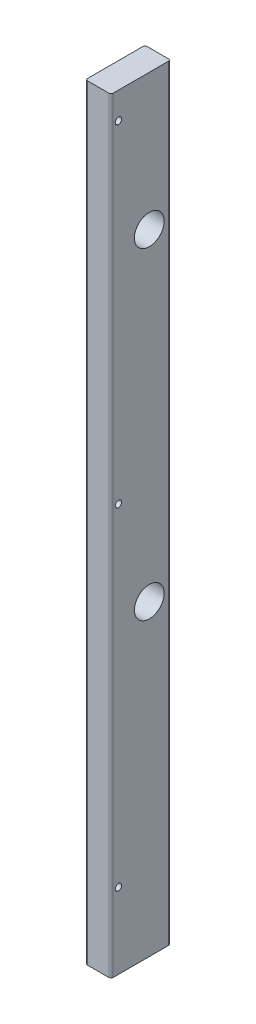
ISO-10303-21;
HEADER;
FILE_DESCRIPTION(('STEP AP214'),'2;1');
FILE_NAME('part.step','',(''),(''),'','','');
FILE_SCHEMA(('AUTOMOTIVE_DESIGN { 1 0 10303 214 1 1 1 1 }'));
ENDSEC;
DATA;
#1=APPLICATION_CONTEXT('core data for automotive mechanical design processes');
#2=APPLICATION_PROTOCOL_DEFINITION('international standard','automotive_design',2000,#1);
#3=PRODUCT_CONTEXT('',#1,'mechanical');
#4=PRODUCT('Part','Part','',(#3));
#5=PRODUCT_RELATED_PRODUCT_CATEGORY('part','',(#4));
#6=PRODUCT_DEFINITION_FORMATION('','',#4);
#7=PRODUCT_DEFINITION_CONTEXT('part definition',#1,'design');
#8=PRODUCT_DEFINITION('design','',#6,#7);
#9=PRODUCT_DEFINITION_SHAPE('','',#8);
#10=(LENGTH_UNIT() NAMED_UNIT(*) SI_UNIT(.MILLI.,.METRE.));
#11=(NAMED_UNIT(*) PLANE_ANGLE_UNIT() SI_UNIT($,.RADIAN.));
#12=(NAMED_UNIT(*) SI_UNIT($,.STERADIAN.) SOLID_ANGLE_UNIT());
#13=UNCERTAINTY_MEASURE_WITH_UNIT(LENGTH_MEASURE(1.E-05),#10,'distance_accuracy_value','');
#14=(GEOMETRIC_REPRESENTATION_CONTEXT(3) GLOBAL_UNCERTAINTY_ASSIGNED_CONTEXT((#13)) GLOBAL_UNIT_ASSIGNED_CONTEXT((#10,
#11,#12)) REPRESENTATION_CONTEXT('',''));
#15=CARTESIAN_POINT('',(0.,0.,0.));
#16=DIRECTION('',(0.,0.,1.));
#17=DIRECTION('',(1.,0.,0.));
#18=AXIS2_PLACEMENT_3D('',#15,#16,#17);
#19=CARTESIAN_POINT('',(19.0500000000009,1143.,44.45));
#20=DIRECTION('',(-1.,0.,0.));
#21=DIRECTION('',(0.,0.,1.));
#22=AXIS2_PLACEMENT_3D('',#19,#20,#21);
#23=PLANE('',#22);
#24=CARTESIAN_POINT('',(19.0500000000009,112.7125,33.3375));
#25=DIRECTION('',(1.,0.,0.));
#26=DIRECTION('',(0.,0.,-1.));
#27=AXIS2_PLACEMENT_3D('',#24,#25,#26);
#28=CIRCLE('',#27,4.7625);
#29=CARTESIAN_POINT('',(19.0500000000009,112.7125,28.575));
#30=VERTEX_POINT('',#29);
#31=EDGE_CURVE('E193',#30,#30,#28,.T.);
#32=ORIENTED_EDGE('',*,*,#31,.F.);
#33=EDGE_LOOP('',(#32));
#34=FACE_BOUND('',#33,.T.);
#35=CARTESIAN_POINT('',(19.0500000000009,608.0125,33.3375));
#36=DIRECTION('',(1.,0.,0.));
#37=DIRECTION('',(0.,0.,-1.));
#38=AXIS2_PLACEMENT_3D('',#35,#36,#37);
#39=CIRCLE('',#38,4.76250000000007);
#40=CARTESIAN_POINT('',(19.0500000000009,608.0125,28.5749999999999));
#41=VERTEX_POINT('',#40);
#42=EDGE_CURVE('E187',#41,#41,#39,.T.);
#43=ORIENTED_EDGE('',*,*,#42,.F.);
#44=EDGE_LOOP('',(#43));
#45=FACE_BOUND('',#44,.T.);
#46=CARTESIAN_POINT('',(19.0500000000009,1103.3125,33.3375000000001));
#47=DIRECTION('',(1.,0.,0.));
#48=DIRECTION('',(0.,0.,-1.));
#49=AXIS2_PLACEMENT_3D('',#46,#47,#48);
#50=CIRCLE('',#49,4.76250000000004);
#51=CARTESIAN_POINT('',(19.0500000000009,1103.3125,28.5750000000001));
#52=VERTEX_POINT('',#51);
#53=EDGE_CURVE('E181',#52,#52,#50,.T.);
#54=ORIENTED_EDGE('',*,*,#53,.F.);
#55=EDGE_LOOP('',(#54));
#56=FACE_BOUND('',#55,.T.);
#57=CARTESIAN_POINT('',(19.0499999999991,458.7875,-12.6999999999999));
#58=DIRECTION('',(1.,0.,0.));
#59=DIRECTION('',(0.,0.,-1.));
#60=AXIS2_PLACEMENT_3D('',#57,#58,#59);
#61=CIRCLE('',#60,22.225);
#62=CARTESIAN_POINT('',(19.0499999999991,458.7875,-34.9249999999999));
#63=VERTEX_POINT('',#62);
#64=EDGE_CURVE('E136',#63,#63,#61,.T.);
#65=ORIENTED_EDGE('',*,*,#64,.F.);
#66=EDGE_LOOP('',(#65));
#67=FACE_BOUND('',#66,.T.);
#68=CARTESIAN_POINT('',(19.0499999999991,939.8,-12.6999999999999));
#69=DIRECTION('',(1.,0.,0.));
#70=DIRECTION('',(0.,0.,-1.));
#71=AXIS2_PLACEMENT_3D('',#68,#69,#70);
#72=CIRCLE('',#71,22.225);
#73=CARTESIAN_POINT('',(19.0499999999991,939.8,-34.9249999999999));
#74=VERTEX_POINT('',#73);
#75=EDGE_CURVE('E175',#74,#74,#72,.T.);
#76=ORIENTED_EDGE('',*,*,#75,.F.);
#77=EDGE_LOOP('',(#76));
#78=FACE_BOUND('',#77,.T.);
#79=DIRECTION('',(0.,0.,-1.));
#80=VECTOR('',#79,1.);
#81=CARTESIAN_POINT('',(19.0500000000009,0.,44.45));
#82=LINE('',#81,#80);
#83=CARTESIAN_POINT('',(19.0500000000009,0.,41.275));
#84=VERTEX_POINT('',#83);
#85=CARTESIAN_POINT('',(19.05,0.,-41.275));
#86=VERTEX_POINT('',#85);
#87=EDGE_CURVE('E128',#84,#86,#82,.T.);
#88=ORIENTED_EDGE('',*,*,#87,.T.);
#89=DIRECTION('',(0.,-1.,0.));
#90=VECTOR('',#89,1.);
#91=CARTESIAN_POINT('',(19.05,1143.,-41.275));
#92=LINE('',#91,#90);
#93=CARTESIAN_POINT('',(19.05,1143.,-41.275));
#94=VERTEX_POINT('',#93);
#95=EDGE_CURVE('E11',#86,#94,#92,.F.);
#96=ORIENTED_EDGE('',*,*,#95,.T.);
#97=DIRECTION('',(0.,0.,-1.));
#98=VECTOR('',#97,1.);
#99=CARTESIAN_POINT('',(19.0500000000009,1143.,44.45));
#100=LINE('',#99,#98);
#101=CARTESIAN_POINT('',(19.0500000000009,1143.,41.275));
#102=VERTEX_POINT('',#101);
#103=EDGE_CURVE('E126',#102,#94,#100,.T.);
#104=ORIENTED_EDGE('',*,*,#103,.F.);
#105=DIRECTION('',(0.,-1.,0.));
#106=VECTOR('',#105,1.);
#107=CARTESIAN_POINT('',(19.0500000000009,1143.,41.275));
#108=LINE('',#107,#106);
#109=EDGE_CURVE('E40',#102,#84,#108,.T.);
#110=ORIENTED_EDGE('',*,*,#109,.T.);
#111=EDGE_LOOP('',(#88,#96,#104,#110));
#112=FACE_BOUND('',#111,.T.);
#113=ADVANCED_FACE('F32',(#34,#45,#56,#67,#78,#112),#23,.F.);
#114=CARTESIAN_POINT('',(-19.05,1143.,-44.4499999999999));
#115=DIRECTION('',(0.,0.,1.));
#116=DIRECTION('',(1.,0.,0.));
#117=AXIS2_PLACEMENT_3D('',#114,#115,#116);
#118=PLANE('',#117);
#119=DIRECTION('',(-1.,0.,0.));
#120=VECTOR('',#119,1.);
#121=CARTESIAN_POINT('',(-19.05,0.,-44.45));
#122=LINE('',#121,#120);
#123=CARTESIAN_POINT('',(15.8750000000001,0.,-44.45));
#124=VERTEX_POINT('',#123);
#125=CARTESIAN_POINT('',(-15.8749999999999,0.,-44.4499999999999));
#126=VERTEX_POINT('',#125);
#127=EDGE_CURVE('E124',#124,#126,#122,.T.);
#128=ORIENTED_EDGE('',*,*,#127,.T.);
#129=DIRECTION('',(0.,-1.,0.));
#130=VECTOR('',#129,1.);
#131=CARTESIAN_POINT('',(-15.8750000000001,1143.,-44.4499999999999));
#132=LINE('',#131,#130);
#133=CARTESIAN_POINT('',(-15.8750000000001,1143.,-44.4499999999999));
#134=VERTEX_POINT('',#133);
#135=EDGE_CURVE('E103',#126,#134,#132,.F.);
#136=ORIENTED_EDGE('',*,*,#135,.T.);
#137=DIRECTION('',(-1.,0.,0.));
#138=VECTOR('',#137,1.);
#139=CARTESIAN_POINT('',(-19.05,1143.,-44.4499999999999));
#140=LINE('',#139,#138);
#141=CARTESIAN_POINT('',(15.8749999999999,1143.,-44.45));
#142=VERTEX_POINT('',#141);
#143=EDGE_CURVE('E171',#142,#134,#140,.T.);
#144=ORIENTED_EDGE('',*,*,#143,.F.);
#145=DIRECTION('',(0.,-1.,0.));
#146=VECTOR('',#145,1.);
#147=CARTESIAN_POINT('',(15.8750000000001,1143.,-44.45));
#148=LINE('',#147,#146);
#149=EDGE_CURVE('E108',#142,#124,#148,.T.);
#150=ORIENTED_EDGE('',*,*,#149,.T.);
#151=EDGE_LOOP('',(#128,#136,#144,#150));
#152=FACE_BOUND('',#151,.T.);
#153=ADVANCED_FACE('F210',(#152),#118,.F.);
#154=CARTESIAN_POINT('',(-19.0499999999991,1143.,44.4500000000001));
#155=DIRECTION('',(1.,0.,0.));
#156=DIRECTION('',(0.,0.,-1.));
#157=AXIS2_PLACEMENT_3D('',#154,#155,#156);
#158=PLANE('',#157);
#159=CARTESIAN_POINT('',(-19.0499999999991,112.7125,33.3375000000001));
#160=DIRECTION('',(1.,0.,0.));
#161=DIRECTION('',(0.,0.,-1.));
#162=AXIS2_PLACEMENT_3D('',#159,#160,#161);
#163=CIRCLE('',#162,4.7625);
#164=CARTESIAN_POINT('',(-19.0499999999991,112.7125,28.5750000000001));
#165=VERTEX_POINT('',#164);
#166=EDGE_CURVE('E178',#165,#165,#163,.T.);
#167=ORIENTED_EDGE('',*,*,#166,.T.);
#168=EDGE_LOOP('',(#167));
#169=FACE_BOUND('',#168,.T.);
#170=CARTESIAN_POINT('',(-19.0499999999991,608.0125,33.3375000000001));
#171=DIRECTION('',(1.,0.,0.));
#172=DIRECTION('',(0.,0.,-1.));
#173=AXIS2_PLACEMENT_3D('',#170,#171,#172);
#174=CIRCLE('',#173,4.76250000000007);
#175=CARTESIAN_POINT('',(-19.0499999999991,608.0125,28.575));
#176=VERTEX_POINT('',#175);
#177=EDGE_CURVE('E190',#176,#176,#174,.T.);
#178=ORIENTED_EDGE('',*,*,#177,.T.);
#179=EDGE_LOOP('',(#178));
#180=FACE_BOUND('',#179,.T.);
#181=CARTESIAN_POINT('',(-19.0499999999991,1103.3125,33.3375000000001));
#182=DIRECTION('',(1.,0.,0.));
#183=DIRECTION('',(0.,0.,-1.));
#184=AXIS2_PLACEMENT_3D('',#181,#182,#183);
#185=CIRCLE('',#184,4.76250000000004);
#186=CARTESIAN_POINT('',(-19.0499999999991,1103.3125,28.5750000000001));
#187=VERTEX_POINT('',#186);
#188=EDGE_CURVE('E184',#187,#187,#185,.T.);
#189=ORIENTED_EDGE('',*,*,#188,.T.);
#190=EDGE_LOOP('',(#189));
#191=FACE_BOUND('',#190,.T.);
#192=CARTESIAN_POINT('',(-19.0500000000009,458.7875,-12.6999999999999));
#193=DIRECTION('',(1.,0.,0.));
#194=DIRECTION('',(0.,0.,-1.));
#195=AXIS2_PLACEMENT_3D('',#192,#193,#194);
#196=CIRCLE('',#195,22.225);
#197=CARTESIAN_POINT('',(-19.0500000000009,458.7875,-34.9249999999999));
#198=VERTEX_POINT('',#197);
#199=EDGE_CURVE('E135',#198,#198,#196,.T.);
#200=ORIENTED_EDGE('',*,*,#199,.T.);
#201=EDGE_LOOP('',(#200));
#202=FACE_BOUND('',#201,.T.);
#203=CARTESIAN_POINT('',(-19.0500000000009,939.8,-12.6999999999999));
#204=DIRECTION('',(1.,0.,0.));
#205=DIRECTION('',(0.,0.,-1.));
#206=AXIS2_PLACEMENT_3D('',#203,#204,#205);
#207=CIRCLE('',#206,22.225);
#208=CARTESIAN_POINT('',(-19.0500000000009,939.8,-34.9249999999999));
#209=VERTEX_POINT('',#208);
#210=EDGE_CURVE('E132',#209,#209,#207,.T.);
#211=ORIENTED_EDGE('',*,*,#210,.T.);
#212=EDGE_LOOP('',(#211));
#213=FACE_BOUND('',#212,.T.);
#214=DIRECTION('',(0.,0.,1.));
#215=VECTOR('',#214,1.);
#216=CARTESIAN_POINT('',(-19.0499999999991,1143.,44.4500000000001));
#217=LINE('',#216,#215);
#218=CARTESIAN_POINT('',(-19.05,1143.,-41.2749999999999));
#219=VERTEX_POINT('',#218);
#220=CARTESIAN_POINT('',(-19.0499999999991,1143.,41.2750000000001));
#221=VERTEX_POINT('',#220);
#222=EDGE_CURVE('E117',#219,#221,#217,.T.);
#223=ORIENTED_EDGE('',*,*,#222,.F.);
#224=DIRECTION('',(0.,-1.,0.));
#225=VECTOR('',#224,1.);
#226=CARTESIAN_POINT('',(-19.05,1143.,-41.2749999999999));
#227=LINE('',#226,#225);
#228=CARTESIAN_POINT('',(-19.05,0.,-41.275));
#229=VERTEX_POINT('',#228);
#230=EDGE_CURVE('E102',#219,#229,#227,.T.);
#231=ORIENTED_EDGE('',*,*,#230,.T.);
#232=DIRECTION('',(0.,0.,1.));
#233=VECTOR('',#232,1.);
#234=CARTESIAN_POINT('',(-19.0499999999991,0.,44.45));
#235=LINE('',#234,#233);
#236=CARTESIAN_POINT('',(-19.0499999999991,0.,41.275));
#237=VERTEX_POINT('',#236);
#238=EDGE_CURVE('E115',#229,#237,#235,.T.);
#239=ORIENTED_EDGE('',*,*,#238,.T.);
#240=DIRECTION('',(0.,-1.,0.));
#241=VECTOR('',#240,1.);
#242=CARTESIAN_POINT('',(-19.0499999999991,1143.,41.2750000000001));
#243=LINE('',#242,#241);
#244=EDGE_CURVE('E119',#237,#221,#243,.F.);
#245=ORIENTED_EDGE('',*,*,#244,.T.);
#246=EDGE_LOOP('',(#223,#231,#239,#245));
#247=FACE_BOUND('',#246,.T.);
#248=ADVANCED_FACE('F114',(#169,#180,#191,#202,#213,#247),#158,.F.);
#249=CARTESIAN_POINT('',(-19.0499999999991,1143.,44.4500000000001));
#250=DIRECTION('',(0.,0.,-1.));
#251=DIRECTION('',(-1.,0.,0.));
#252=AXIS2_PLACEMENT_3D('',#249,#250,#251);
#253=PLANE('',#252);
#254=DIRECTION('',(1.,0.,0.));
#255=VECTOR('',#254,1.);
#256=CARTESIAN_POINT('',(-19.0499999999991,1143.,44.4500000000001));
#257=LINE('',#256,#255);
#258=CARTESIAN_POINT('',(-15.8749999999992,1143.,44.4500000000001));
#259=VERTEX_POINT('',#258);
#260=CARTESIAN_POINT('',(15.8750000000007,1143.,44.45));
#261=VERTEX_POINT('',#260);
#262=EDGE_CURVE('E139',#259,#261,#257,.T.);
#263=ORIENTED_EDGE('',*,*,#262,.F.);
#264=DIRECTION('',(0.,-1.,0.));
#265=VECTOR('',#264,1.);
#266=CARTESIAN_POINT('',(-15.8749999999992,1143.,44.4500000000001));
#267=LINE('',#266,#265);
#268=CARTESIAN_POINT('',(-15.8749999999992,0.,44.4500000000001));
#269=VERTEX_POINT('',#268);
#270=EDGE_CURVE('E156',#259,#269,#267,.T.);
#271=ORIENTED_EDGE('',*,*,#270,.T.);
#272=DIRECTION('',(1.,0.,0.));
#273=VECTOR('',#272,1.);
#274=CARTESIAN_POINT('',(-19.0499999999991,0.,44.45));
#275=LINE('',#274,#273);
#276=CARTESIAN_POINT('',(15.8750000000007,0.,44.45));
#277=VERTEX_POINT('',#276);
#278=EDGE_CURVE('E123',#269,#277,#275,.T.);
#279=ORIENTED_EDGE('',*,*,#278,.T.);
#280=DIRECTION('',(0.,-1.,0.));
#281=VECTOR('',#280,1.);
#282=CARTESIAN_POINT('',(15.8750000000007,1143.,44.45));
#283=LINE('',#282,#281);
#284=EDGE_CURVE('E47',#277,#261,#283,.F.);
#285=ORIENTED_EDGE('',*,*,#284,.T.);
#286=EDGE_LOOP('',(#263,#271,#279,#285));
#287=FACE_BOUND('',#286,.T.);
#288=ADVANCED_FACE('F228',(#287),#253,.F.);
#289=CARTESIAN_POINT('',(0.,1143.,0.));
#290=DIRECTION('',(0.,-1.,0.));
#291=DIRECTION('',(0.,0.,-1.));
#292=AXIS2_PLACEMENT_3D('',#289,#290,#291);
#293=PLANE('',#292);
#294=ORIENTED_EDGE('',*,*,#143,.T.);
#295=CARTESIAN_POINT('',(-15.8750000000001,1143.,-41.2749999999999));
#296=DIRECTION('',(0.,-1.,0.));
#297=DIRECTION('',(0.,0.,-1.));
#298=AXIS2_PLACEMENT_3D('',#295,#296,#297);
#299=CIRCLE('',#298,3.175);
#300=EDGE_CURVE('E153',#134,#219,#299,.F.);
#301=ORIENTED_EDGE('',*,*,#300,.T.);
#302=ORIENTED_EDGE('',*,*,#222,.T.);
#303=CARTESIAN_POINT('',(-15.8749999999992,1143.,41.2750000000001));
#304=DIRECTION('',(0.,-1.,0.));
#305=DIRECTION('',(0.,0.,-1.));
#306=AXIS2_PLACEMENT_3D('',#303,#304,#305);
#307=CIRCLE('',#306,3.175);
#308=EDGE_CURVE('E54',#221,#259,#307,.F.);
#309=ORIENTED_EDGE('',*,*,#308,.T.);
#310=ORIENTED_EDGE('',*,*,#262,.T.);
#311=CARTESIAN_POINT('',(15.8750000000007,1143.,41.275));
#312=DIRECTION('',(0.,-1.,0.));
#313=DIRECTION('',(0.,0.,-1.));
#314=AXIS2_PLACEMENT_3D('',#311,#312,#313);
#315=CIRCLE('',#314,3.175);
#316=EDGE_CURVE('E148',#261,#102,#315,.F.);
#317=ORIENTED_EDGE('',*,*,#316,.T.);
#318=ORIENTED_EDGE('',*,*,#103,.T.);
#319=CARTESIAN_POINT('',(15.8750000000001,1143.,-41.275));
#320=DIRECTION('',(0.,-1.,0.));
#321=DIRECTION('',(0.,0.,-1.));
#322=AXIS2_PLACEMENT_3D('',#319,#320,#321);
#323=CIRCLE('',#322,3.175);
#324=EDGE_CURVE('E150',#94,#142,#323,.F.);
#325=ORIENTED_EDGE('',*,*,#324,.T.);
#326=EDGE_LOOP('',(#294,#301,#302,#309,#310,#317,#318,#325));
#327=FACE_BOUND('',#326,.T.);
#328=ADVANCED_FACE('F234',(#327),#293,.F.);
#329=CARTESIAN_POINT('',(0.,0.,0.));
#330=DIRECTION('',(0.,-1.,0.));
#331=DIRECTION('',(0.,0.,-1.));
#332=AXIS2_PLACEMENT_3D('',#329,#330,#331);
#333=PLANE('',#332);
#334=ORIENTED_EDGE('',*,*,#238,.F.);
#335=CARTESIAN_POINT('',(-15.8749999999999,0.,-41.2749999999999));
#336=DIRECTION('',(0.,-1.,0.));
#337=DIRECTION('',(0.,0.,-1.));
#338=AXIS2_PLACEMENT_3D('',#335,#336,#337);
#339=CIRCLE('',#338,3.175);
#340=EDGE_CURVE('E98',#229,#126,#339,.T.);
#341=ORIENTED_EDGE('',*,*,#340,.T.);
#342=ORIENTED_EDGE('',*,*,#127,.F.);
#343=CARTESIAN_POINT('',(15.8750000000001,0.,-41.275));
#344=DIRECTION('',(0.,-1.,0.));
#345=DIRECTION('',(0.,0.,-1.));
#346=AXIS2_PLACEMENT_3D('',#343,#344,#345);
#347=CIRCLE('',#346,3.175);
#348=EDGE_CURVE('E142',#124,#86,#347,.T.);
#349=ORIENTED_EDGE('',*,*,#348,.T.);
#350=ORIENTED_EDGE('',*,*,#87,.F.);
#351=CARTESIAN_POINT('',(15.875000000001,0.,41.275));
#352=DIRECTION('',(0.,-1.,0.));
#353=DIRECTION('',(0.,0.,-1.));
#354=AXIS2_PLACEMENT_3D('',#351,#352,#353);
#355=CIRCLE('',#354,3.175);
#356=EDGE_CURVE('E118',#84,#277,#355,.T.);
#357=ORIENTED_EDGE('',*,*,#356,.T.);
#358=ORIENTED_EDGE('',*,*,#278,.F.);
#359=CARTESIAN_POINT('',(-15.8749999999992,0.,41.2750000000001));
#360=DIRECTION('',(0.,-1.,0.));
#361=DIRECTION('',(0.,0.,-1.));
#362=AXIS2_PLACEMENT_3D('',#359,#360,#361);
#363=CIRCLE('',#362,3.175);
#364=EDGE_CURVE('E109',#269,#237,#363,.T.);
#365=ORIENTED_EDGE('',*,*,#364,.T.);
#366=EDGE_LOOP('',(#334,#341,#342,#349,#350,#357,#358,#365));
#367=FACE_BOUND('',#366,.T.);
#368=ADVANCED_FACE('F121',(#367),#333,.T.);
#369=CARTESIAN_POINT('',(-899.6045,939.8,-12.7));
#370=DIRECTION('',(1.,0.,0.));
#371=DIRECTION('',(0.,0.,-1.));
#372=AXIS2_PLACEMENT_3D('',#369,#370,#371);
#373=CYLINDRICAL_SURFACE('',#372,22.225);
#374=ORIENTED_EDGE('',*,*,#75,.T.);
#375=EDGE_LOOP('',(#374));
#376=FACE_BOUND('',#375,.T.);
#377=ORIENTED_EDGE('',*,*,#210,.F.);
#378=EDGE_LOOP('',(#377));
#379=FACE_BOUND('',#378,.T.);
#380=ADVANCED_FACE('F220',(#376,#379),#373,.F.);
#381=CARTESIAN_POINT('',(-899.6045,458.7875,-12.6999999999999));
#382=DIRECTION('',(1.,0.,0.));
#383=DIRECTION('',(0.,0.,-1.));
#384=AXIS2_PLACEMENT_3D('',#381,#382,#383);
#385=CYLINDRICAL_SURFACE('',#384,22.225);
#386=ORIENTED_EDGE('',*,*,#64,.T.);
#387=EDGE_LOOP('',(#386));
#388=FACE_BOUND('',#387,.T.);
#389=ORIENTED_EDGE('',*,*,#199,.F.);
#390=EDGE_LOOP('',(#389));
#391=FACE_BOUND('',#390,.T.);
#392=ADVANCED_FACE('F223',(#388,#391),#385,.F.);
#393=CARTESIAN_POINT('',(-19.0499999999991,1103.3125,33.3375000000001));
#394=DIRECTION('',(1.,0.,0.));
#395=DIRECTION('',(0.,0.,-1.));
#396=AXIS2_PLACEMENT_3D('',#393,#394,#395);
#397=CYLINDRICAL_SURFACE('',#396,4.76250000000004);
#398=ORIENTED_EDGE('',*,*,#188,.F.);
#399=EDGE_LOOP('',(#398));
#400=FACE_BOUND('',#399,.T.);
#401=ORIENTED_EDGE('',*,*,#53,.T.);
#402=EDGE_LOOP('',(#401));
#403=FACE_BOUND('',#402,.T.);
#404=ADVANCED_FACE('F263',(#400,#403),#397,.F.);
#405=CARTESIAN_POINT('',(-19.0499999999991,608.0125,33.3375000000001));
#406=DIRECTION('',(1.,0.,0.));
#407=DIRECTION('',(0.,0.,-1.));
#408=AXIS2_PLACEMENT_3D('',#405,#406,#407);
#409=CYLINDRICAL_SURFACE('',#408,4.76250000000007);
#410=ORIENTED_EDGE('',*,*,#177,.F.);
#411=EDGE_LOOP('',(#410));
#412=FACE_BOUND('',#411,.T.);
#413=ORIENTED_EDGE('',*,*,#42,.T.);
#414=EDGE_LOOP('',(#413));
#415=FACE_BOUND('',#414,.T.);
#416=ADVANCED_FACE('F204',(#412,#415),#409,.F.);
#417=CARTESIAN_POINT('',(-19.0499999999991,112.7125,33.3375000000001));
#418=DIRECTION('',(1.,0.,0.));
#419=DIRECTION('',(0.,0.,-1.));
#420=AXIS2_PLACEMENT_3D('',#417,#418,#419);
#421=CYLINDRICAL_SURFACE('',#420,4.7625);
#422=ORIENTED_EDGE('',*,*,#166,.F.);
#423=EDGE_LOOP('',(#422));
#424=FACE_BOUND('',#423,.T.);
#425=ORIENTED_EDGE('',*,*,#31,.T.);
#426=EDGE_LOOP('',(#425));
#427=FACE_BOUND('',#426,.T.);
#428=ADVANCED_FACE('F201',(#424,#427),#421,.F.);
#429=CARTESIAN_POINT('',(-15.8750000000001,1143.,-41.2749999999999));
#430=DIRECTION('',(0.,-1.,0.));
#431=DIRECTION('',(0.,0.,-1.));
#432=AXIS2_PLACEMENT_3D('',#429,#430,#431);
#433=CYLINDRICAL_SURFACE('',#432,3.175);
#434=ORIENTED_EDGE('',*,*,#300,.F.);
#435=ORIENTED_EDGE('',*,*,#135,.F.);
#436=ORIENTED_EDGE('',*,*,#340,.F.);
#437=ORIENTED_EDGE('',*,*,#230,.F.);
#438=EDGE_LOOP('',(#434,#435,#436,#437));
#439=FACE_BOUND('',#438,.T.);
#440=ADVANCED_FACE('F101',(#439),#433,.T.);
#441=CARTESIAN_POINT('',(-15.8749999999992,1143.,41.2750000000001));
#442=DIRECTION('',(0.,-1.,0.));
#443=DIRECTION('',(0.,0.,-1.));
#444=AXIS2_PLACEMENT_3D('',#441,#442,#443);
#445=CYLINDRICAL_SURFACE('',#444,3.175);
#446=ORIENTED_EDGE('',*,*,#308,.F.);
#447=ORIENTED_EDGE('',*,*,#244,.F.);
#448=ORIENTED_EDGE('',*,*,#364,.F.);
#449=ORIENTED_EDGE('',*,*,#270,.F.);
#450=EDGE_LOOP('',(#446,#447,#448,#449));
#451=FACE_BOUND('',#450,.T.);
#452=ADVANCED_FACE('F242',(#451),#445,.T.);
#453=CARTESIAN_POINT('',(15.8750000000001,1143.,-41.275));
#454=DIRECTION('',(0.,-1.,0.));
#455=DIRECTION('',(0.,0.,-1.));
#456=AXIS2_PLACEMENT_3D('',#453,#454,#455);
#457=CYLINDRICAL_SURFACE('',#456,3.175);
#458=ORIENTED_EDGE('',*,*,#324,.F.);
#459=ORIENTED_EDGE('',*,*,#95,.F.);
#460=ORIENTED_EDGE('',*,*,#348,.F.);
#461=ORIENTED_EDGE('',*,*,#149,.F.);
#462=EDGE_LOOP('',(#458,#459,#460,#461));
#463=FACE_BOUND('',#462,.T.);
#464=ADVANCED_FACE('F244',(#463),#457,.T.);
#465=CARTESIAN_POINT('',(15.8750000000007,1143.,41.275));
#466=DIRECTION('',(0.,-1.,0.));
#467=DIRECTION('',(0.,0.,-1.));
#468=AXIS2_PLACEMENT_3D('',#465,#466,#467);
#469=CYLINDRICAL_SURFACE('',#468,3.175);
#470=ORIENTED_EDGE('',*,*,#316,.F.);
#471=ORIENTED_EDGE('',*,*,#284,.F.);
#472=ORIENTED_EDGE('',*,*,#356,.F.);
#473=ORIENTED_EDGE('',*,*,#109,.F.);
#474=EDGE_LOOP('',(#470,#471,#472,#473));
#475=FACE_BOUND('',#474,.T.);
#476=ADVANCED_FACE('F34',(#475),#469,.T.);
#477=CLOSED_SHELL('',(#113,#153,#248,#288,#328,#368,#380,#392,#404,#416,#428,#440,#452,#464,#476));
#478=MANIFOLD_SOLID_BREP('B2',#477);
#479=ADVANCED_BREP_SHAPE_REPRESENTATION('',(#18,#478),#14);
#480=SHAPE_DEFINITION_REPRESENTATION(#9,#479);
ENDSEC;
END-ISO-10303-21;
